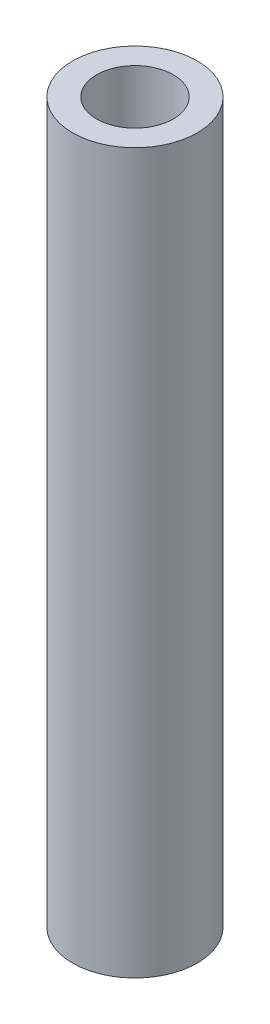
ISO-10303-21;
HEADER;
FILE_DESCRIPTION(('STEP AP214'),'2;1');
FILE_NAME('part.step','',(''),(''),'','','');
FILE_SCHEMA(('AUTOMOTIVE_DESIGN { 1 0 10303 214 1 1 1 1 }'));
ENDSEC;
DATA;
#1=APPLICATION_CONTEXT('core data for automotive mechanical design processes');
#2=APPLICATION_PROTOCOL_DEFINITION('international standard','automotive_design',2000,#1);
#3=PRODUCT_CONTEXT('',#1,'mechanical');
#4=PRODUCT('Part','Part','',(#3));
#5=PRODUCT_RELATED_PRODUCT_CATEGORY('part','',(#4));
#6=PRODUCT_DEFINITION_FORMATION('','',#4);
#7=PRODUCT_DEFINITION_CONTEXT('part definition',#1,'design');
#8=PRODUCT_DEFINITION('design','',#6,#7);
#9=PRODUCT_DEFINITION_SHAPE('','',#8);
#10=(LENGTH_UNIT() NAMED_UNIT(*) SI_UNIT(.MILLI.,.METRE.));
#11=(NAMED_UNIT(*) PLANE_ANGLE_UNIT() SI_UNIT($,.RADIAN.));
#12=(NAMED_UNIT(*) SI_UNIT($,.STERADIAN.) SOLID_ANGLE_UNIT());
#13=UNCERTAINTY_MEASURE_WITH_UNIT(LENGTH_MEASURE(1.E-05),#10,'distance_accuracy_value','');
#14=(GEOMETRIC_REPRESENTATION_CONTEXT(3) GLOBAL_UNCERTAINTY_ASSIGNED_CONTEXT((#13)) GLOBAL_UNIT_ASSIGNED_CONTEXT((#10,
#11,#12)) REPRESENTATION_CONTEXT('',''));
#15=CARTESIAN_POINT('',(0.,0.,0.));
#16=DIRECTION('',(0.,0.,1.));
#17=DIRECTION('',(1.,0.,0.));
#18=AXIS2_PLACEMENT_3D('',#15,#16,#17);
#19=CARTESIAN_POINT('',(-20.,33.,-25.));
#20=DIRECTION('',(0.,1.,0.));
#21=DIRECTION('',(0.,0.,1.));
#22=AXIS2_PLACEMENT_3D('',#19,#20,#21);
#23=PLANE('',#22);
#24=CARTESIAN_POINT('',(-20.,33.,-25.));
#25=DIRECTION('',(0.,1.,0.));
#26=DIRECTION('',(0.,0.,1.));
#27=AXIS2_PLACEMENT_3D('',#24,#25,#26);
#28=CIRCLE('',#27,2.6);
#29=CARTESIAN_POINT('',(-20.,33.,-22.4));
#30=VERTEX_POINT('',#29);
#31=EDGE_CURVE('E10',#30,#30,#28,.T.);
#32=ORIENTED_EDGE('',*,*,#31,.T.);
#33=EDGE_LOOP('',(#32));
#34=FACE_BOUND('',#33,.T.);
#35=CARTESIAN_POINT('',(-20.,33.,-25.));
#36=DIRECTION('',(0.,1.,0.));
#37=DIRECTION('',(0.,0.,1.));
#38=AXIS2_PLACEMENT_3D('',#35,#36,#37);
#39=CIRCLE('',#38,1.6);
#40=CARTESIAN_POINT('',(-20.,33.,-23.4));
#41=VERTEX_POINT('',#40);
#42=EDGE_CURVE('E42',#41,#41,#39,.T.);
#43=ORIENTED_EDGE('',*,*,#42,.F.);
#44=EDGE_LOOP('',(#43));
#45=FACE_BOUND('',#44,.T.);
#46=ADVANCED_FACE('F31',(#34,#45),#23,.T.);
#47=CARTESIAN_POINT('',(-20.,3.,-25.));
#48=DIRECTION('',(0.,1.,0.));
#49=DIRECTION('',(0.,0.,1.));
#50=AXIS2_PLACEMENT_3D('',#47,#48,#49);
#51=PLANE('',#50);
#52=CARTESIAN_POINT('',(-20.,3.,-25.));
#53=DIRECTION('',(0.,1.,0.));
#54=DIRECTION('',(0.,0.,1.));
#55=AXIS2_PLACEMENT_3D('',#52,#53,#54);
#56=CIRCLE('',#55,2.6);
#57=CARTESIAN_POINT('',(-20.,3.,-22.4));
#58=VERTEX_POINT('',#57);
#59=EDGE_CURVE('E35',#58,#58,#56,.T.);
#60=ORIENTED_EDGE('',*,*,#59,.F.);
#61=EDGE_LOOP('',(#60));
#62=FACE_BOUND('',#61,.T.);
#63=CARTESIAN_POINT('',(-20.,3.,-25.));
#64=DIRECTION('',(0.,1.,0.));
#65=DIRECTION('',(0.,0.,1.));
#66=AXIS2_PLACEMENT_3D('',#63,#64,#65);
#67=CIRCLE('',#66,1.6);
#68=CARTESIAN_POINT('',(-20.,3.,-23.4));
#69=VERTEX_POINT('',#68);
#70=EDGE_CURVE('E44',#69,#69,#67,.T.);
#71=ORIENTED_EDGE('',*,*,#70,.T.);
#72=EDGE_LOOP('',(#71));
#73=FACE_BOUND('',#72,.T.);
#74=ADVANCED_FACE('F54',(#62,#73),#51,.F.);
#75=CARTESIAN_POINT('',(-20.,33.,-25.));
#76=DIRECTION('',(0.,-1.,0.));
#77=DIRECTION('',(0.,0.,-1.));
#78=AXIS2_PLACEMENT_3D('',#75,#76,#77);
#79=CYLINDRICAL_SURFACE('',#78,2.6);
#80=ORIENTED_EDGE('',*,*,#31,.F.);
#81=EDGE_LOOP('',(#80));
#82=FACE_BOUND('',#81,.T.);
#83=ORIENTED_EDGE('',*,*,#59,.T.);
#84=EDGE_LOOP('',(#83));
#85=FACE_BOUND('',#84,.T.);
#86=ADVANCED_FACE('F33',(#82,#85),#79,.T.);
#87=CARTESIAN_POINT('',(-20.,33.,-25.));
#88=DIRECTION('',(0.,-1.,0.));
#89=DIRECTION('',(0.,0.,-1.));
#90=AXIS2_PLACEMENT_3D('',#87,#88,#89);
#91=CYLINDRICAL_SURFACE('',#90,1.6);
#92=ORIENTED_EDGE('',*,*,#42,.T.);
#93=EDGE_LOOP('',(#92));
#94=FACE_BOUND('',#93,.T.);
#95=ORIENTED_EDGE('',*,*,#70,.F.);
#96=EDGE_LOOP('',(#95));
#97=FACE_BOUND('',#96,.T.);
#98=ADVANCED_FACE('F50',(#94,#97),#91,.F.);
#99=CLOSED_SHELL('',(#46,#74,#86,#98));
#100=MANIFOLD_SOLID_BREP('B2',#99);
#101=ADVANCED_BREP_SHAPE_REPRESENTATION('',(#18,#100),#14);
#102=SHAPE_DEFINITION_REPRESENTATION(#9,#101);
ENDSEC;
END-ISO-10303-21;
